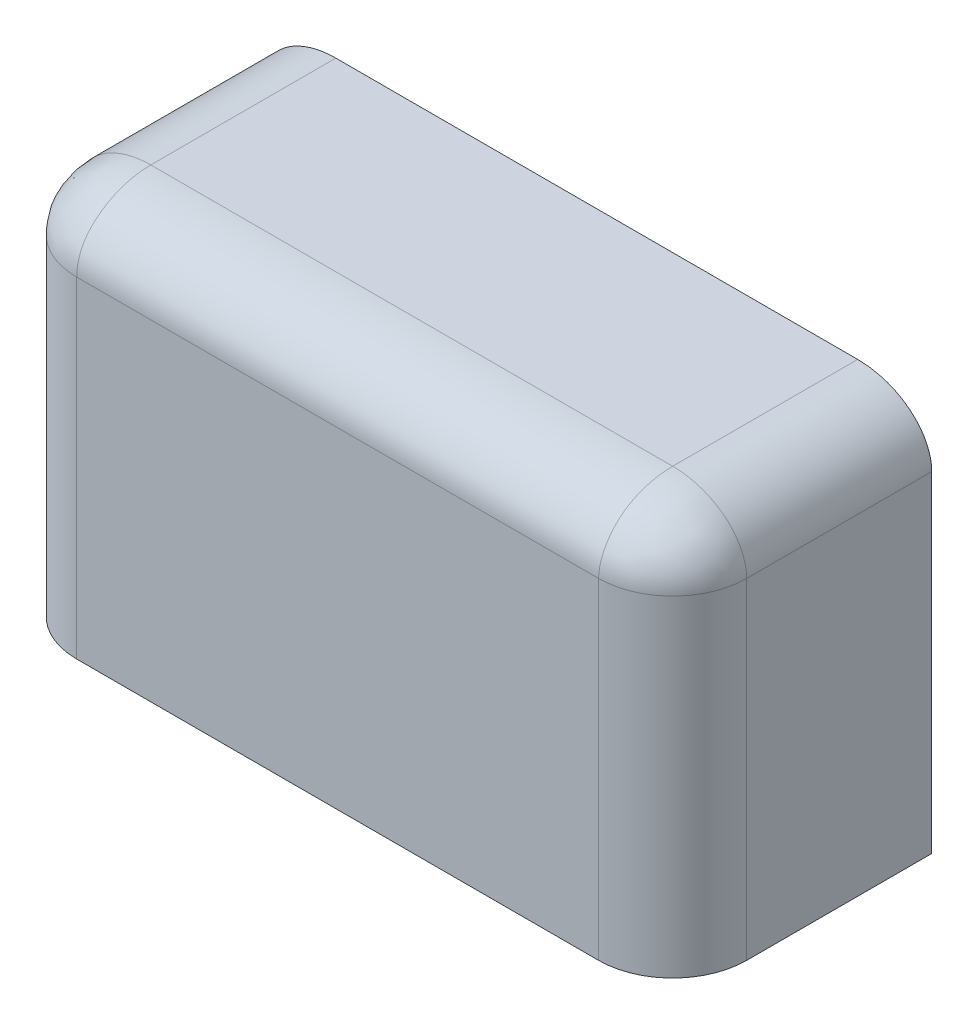
ISO-10303-21;
HEADER;
FILE_DESCRIPTION(('STEP AP214'),'2;1');
FILE_NAME('part.step','',(''),(''),'','','');
FILE_SCHEMA(('AUTOMOTIVE_DESIGN { 1 0 10303 214 1 1 1 1 }'));
ENDSEC;
DATA;
#1=APPLICATION_CONTEXT('core data for automotive mechanical design processes');
#2=APPLICATION_PROTOCOL_DEFINITION('international standard','automotive_design',2000,#1);
#3=PRODUCT_CONTEXT('',#1,'mechanical');
#4=PRODUCT('Part','Part','',(#3));
#5=PRODUCT_RELATED_PRODUCT_CATEGORY('part','',(#4));
#6=PRODUCT_DEFINITION_FORMATION('','',#4);
#7=PRODUCT_DEFINITION_CONTEXT('part definition',#1,'design');
#8=PRODUCT_DEFINITION('design','',#6,#7);
#9=PRODUCT_DEFINITION_SHAPE('','',#8);
#10=(LENGTH_UNIT() NAMED_UNIT(*) SI_UNIT(.MILLI.,.METRE.));
#11=(NAMED_UNIT(*) PLANE_ANGLE_UNIT() SI_UNIT($,.RADIAN.));
#12=(NAMED_UNIT(*) SI_UNIT($,.STERADIAN.) SOLID_ANGLE_UNIT());
#13=UNCERTAINTY_MEASURE_WITH_UNIT(LENGTH_MEASURE(1.E-05),#10,'distance_accuracy_value','');
#14=(GEOMETRIC_REPRESENTATION_CONTEXT(3) GLOBAL_UNCERTAINTY_ASSIGNED_CONTEXT((#13)) GLOBAL_UNIT_ASSIGNED_CONTEXT((#10,
#11,#12)) REPRESENTATION_CONTEXT('',''));
#15=CARTESIAN_POINT('',(0.,0.,0.));
#16=DIRECTION('',(0.,0.,1.));
#17=DIRECTION('',(1.,0.,0.));
#18=AXIS2_PLACEMENT_3D('',#15,#16,#17);
#19=CARTESIAN_POINT('',(6.89300000000001,1.646875,9.145));
#20=CARTESIAN_POINT('',(1.00700000000001,1.646875,9.145));
#21=CARTESIAN_POINT('',(6.89300000000001,1.728125,9.145));
#22=CARTESIAN_POINT('',(1.00700000000001,1.728125,9.145));
#23=CARTESIAN_POINT('',(6.89300000000001,1.728125,9.04500000000001));
#24=CARTESIAN_POINT('',(1.00700000000001,1.728125,9.04500000000001));
#25=(BOUNDED_SURFACE() B_SPLINE_SURFACE(2,1,((#19,#20),(#21,#22),(#23,#24)),.UNSPECIFIED.,.F.,
.F.,.F.) B_SPLINE_SURFACE_WITH_KNOTS((3,3),(2,2),(0.,0.157079632679477),(0.,0.5886),
.UNSPECIFIED.) GEOMETRIC_REPRESENTATION_ITEM() RATIONAL_B_SPLINE_SURFACE(((1.,1.),
(0.707106781186592,0.707106781186592),(1.,1.))) REPRESENTATION_ITEM('') SURFACE());
#26=CARTESIAN_POINT('',(4.08800000000001,1.646875,9.145));
#27=CARTESIAN_POINT('',(4.08800000008538,1.64784121551079,9.14500002913551));
#28=CARTESIAN_POINT('',(4.08799712587005,1.64880741868321,9.14497878841751));
#29=CARTESIAN_POINT('',(4.08798669487844,1.65072184907224,9.14489468705347));
#30=CARTESIAN_POINT('',(4.08797921695327,1.65167010746846,9.14483252606202));
#31=CARTESIAN_POINT('',(4.08796073751127,1.65354691512894,9.14466888422808));
#32=CARTESIAN_POINT('',(4.08794979815781,1.65447552506544,9.14456809089738));
#33=CARTESIAN_POINT('',(4.08792545115165,1.65631150980605,9.14432962203084));
#34=CARTESIAN_POINT('',(4.0879120898129,1.65721897274695,9.14419261952062));
#35=CARTESIAN_POINT('',(4.08788384784134,1.65901133064115,9.14388422642394));
#36=CARTESIAN_POINT('',(4.08786899858087,1.65989633931593,9.14371349323268));
#37=CARTESIAN_POINT('',(4.08783862251913,1.66164264696131,9.14334017914098));
#38=CARTESIAN_POINT('',(4.08782311310937,1.66250408329896,9.14313823884373));
#39=CARTESIAN_POINT('',(4.08779215168235,1.66420228856385,9.14270507051369));
#40=CARTESIAN_POINT('',(4.08777670408079,1.66503921658062,9.1424744653773));
#41=CARTESIAN_POINT('',(4.08774649607258,1.66668762401255,9.14198652692844));
#42=CARTESIAN_POINT('',(4.08773172815048,1.66749928232381,9.14172979801903));
#43=CARTESIAN_POINT('',(4.08770340695862,1.6690965369633,9.14119215181674));
#44=CARTESIAN_POINT('',(4.08768983532491,1.66988233009174,9.14091181977343));
#45=CARTESIAN_POINT('',(4.08766433549995,1.67142739900859,9.14032947052088));
#46=CARTESIAN_POINT('',(4.08765237921761,1.67218688761969,9.14002801884776));
#47=CARTESIAN_POINT('',(4.08763044477962,1.67367904087995,9.13940588133218));
#48=CARTESIAN_POINT('',(4.08762042996387,1.67441193249281,9.13908574086143));
#49=CARTESIAN_POINT('',(4.0876026237761,1.67585072004349,9.138428613691));
#50=CARTESIAN_POINT('',(4.08759478837945,1.67655685529574,9.13809215179342));
#51=CARTESIAN_POINT('',(4.08758150374989,1.67794209407518,9.13740468766164));
#52=CARTESIAN_POINT('',(4.08757600434403,1.67862144724752,9.13705418952258));
#53=CARTESIAN_POINT('',(4.0875674732723,1.67995316857554,9.13634089604688));
#54=CARTESIAN_POINT('',(4.08756438664039,1.6806057956812,9.135978583403));
#55=CARTESIAN_POINT('',(4.08755893087129,1.68249971039437,9.13489003797296));
#56=CARTESIAN_POINT('',(4.08755987665968,1.68372611801359,9.13413767158116));
#57=CARTESIAN_POINT('',(4.0875713429439,1.68607306381442,9.13260644035507));
#58=CARTESIAN_POINT('',(4.0875813683653,1.68719580265248,9.13183092994232));
#59=CARTESIAN_POINT('',(4.0876094732935,1.68933919287416,9.13026770050558));
#60=CARTESIAN_POINT('',(4.08762707850913,1.69036206045577,9.1294830094203));
#61=CARTESIAN_POINT('',(4.08766815585539,1.69231023205196,9.12791406254203));
#62=CARTESIAN_POINT('',(4.08769122018975,1.6932377306513,9.12713251680655));
#63=CARTESIAN_POINT('',(4.08774047223442,1.69500033391819,9.12558079604631));
#64=CARTESIAN_POINT('',(4.08776636992656,1.69583757118276,9.12481303126196));
#65=CARTESIAN_POINT('',(4.08781831590242,1.69742518202679,9.12329820183076));
#66=CARTESIAN_POINT('',(4.08784423472043,1.6981775948014,9.12255326774538));
#67=CARTESIAN_POINT('',(4.08789255287597,1.69960125031349,9.12109193543051));
#68=CARTESIAN_POINT('',(4.08791507105923,1.70027441379872,9.12037740997164));
#69=CARTESIAN_POINT('',(4.08795430861005,1.7015452597165,9.11898336686188));
#70=CARTESIAN_POINT('',(4.08797134389381,1.7021447262055,9.11830548625516));
#71=CARTESIAN_POINT('',(4.08799221265772,1.70327369907627,9.116990022562));
#72=CARTESIAN_POINT('',(4.08799703766568,1.7038048439651,9.1163538574323));
#73=CARTESIAN_POINT('',(4.08800633830618,1.70544555930297,9.11433451089498));
#74=CARTESIAN_POINT('',(4.08800414924348,1.70652449153292,9.11292623255284));
#75=CARTESIAN_POINT('',(4.08801078923052,1.70857725386046,9.11008801090438));
#76=CARTESIAN_POINT('',(4.08801934729364,1.70955302256446,9.10865946336097));
#77=CARTESIAN_POINT('',(4.08804476046452,1.71140406565511,9.10579197270239));
#78=CARTESIAN_POINT('',(4.08806139051596,1.71228131329827,9.10435430015859));
#79=CARTESIAN_POINT('',(4.08809049431457,1.71394865510063,9.10146424601309));
#80=CARTESIAN_POINT('',(4.08810303852678,1.71474004998219,9.10001261455416));
#81=CARTESIAN_POINT('',(4.08811864639176,1.71624488906093,9.09709110864104));
#82=CARTESIAN_POINT('',(4.08812182008632,1.71695914235206,9.09562165110982));
#83=CARTESIAN_POINT('',(4.08812322689579,1.71831245516666,9.09266934008545));
#84=CARTESIAN_POINT('',(4.08812151741246,1.71895229706085,9.09118684478782));
#85=CARTESIAN_POINT('',(4.08811459186155,1.72015956718829,9.08821260842374));
#86=CARTESIAN_POINT('',(4.08810941650262,1.72072774611069,9.08672117166391));
#87=CARTESIAN_POINT('',(4.08809735124867,1.72179441844926,9.08373259521167));
#88=CARTESIAN_POINT('',(4.08809048138198,1.72229362655125,9.08223571025864));
#89=CARTESIAN_POINT('',(4.08807628121304,1.72322499401868,9.07923922101693));
#90=CARTESIAN_POINT('',(4.08806895677997,1.72365782805085,9.0777398262));
#91=CARTESIAN_POINT('',(4.08805481880035,1.72445895462084,9.07474079509188));
#92=CARTESIAN_POINT('',(4.08804800069062,1.7248278781179,9.07324132721347));
#93=CARTESIAN_POINT('',(4.08803551906345,1.72550353106243,9.07024416884574));
#94=CARTESIAN_POINT('',(4.08802984470494,1.72581084431755,9.06874660989172));
#95=CARTESIAN_POINT('',(4.08802000275877,1.72636543805768,9.06575487313305));
#96=CARTESIAN_POINT('',(4.08801582160568,1.72661325194436,9.06426079416448));
#97=CARTESIAN_POINT('',(4.08800904503433,1.72705079930041,9.06127724739038));
#98=CARTESIAN_POINT('',(4.08800643632424,1.72724101264432,9.05978784992688));
#99=CARTESIAN_POINT('',(4.08800262840614,1.72756508057354,9.05681456213647));
#100=CARTESIAN_POINT('',(4.08800141848312,1.72769935848808,9.05533071792146));
#101=CARTESIAN_POINT('',(4.08800001843425,1.72791303071054,9.05236913982555));
#102=CARTESIAN_POINT('',(4.08799982149008,1.72799278882665,9.05089143216654));
#103=CARTESIAN_POINT('',(4.08799979458485,1.72809861944531,9.04794247431517));
#104=CARTESIAN_POINT('',(4.08799996255202,1.72812499339234,9.04647123493985));
#105=CARTESIAN_POINT('',(4.08800000000001,1.728125,9.04500000000001));
#106=B_SPLINE_CURVE_WITH_KNOTS('',3,(#26,#27,#28,#29,#30,#31,#32,#33,#34,#35,#36,#37,#38,#39,
#40,#41,#42,#43,#44,#45,#46,#47,#48,#49,#50,#51,#52,#53,#54,#55,#56,#57,#58,#59,#60,#61,#62,#63,
#64,#65,#66,#67,#68,#69,#70,#71,#72,#73,#74,#75,#76,#77,#78,#79,#80,#81,#82,#83,#84,#85,#86,#87,
#88,#89,#90,#91,#92,#93,#94,#95,#96,#97,#98,#99,#100,#101,#102,#103,#104,#105),.UNSPECIFIED.,
.F.,.F.,(4,2,2,2,2,2,2,2,2,2,2,2,2,2,2,2,2,2,2,2,2,2,2,2,2,2,2,2,2,2,2,2,2,2,2,2,2,2,2,4),(0.,
0.00289838836293901,0.00574846416443204,0.00855001234060927,0.0113027609305556,
0.0140063788483132,0.0166604770394338,0.0192646124759638,0.0218182944210215,0.0243209923999056,
0.0267721453436243,0.0291711714169603,0.0315174781011406,0.0338104721659721,0.0360495692333714,
0.0403633966732016,0.0444552990403839,0.0483217046226117,0.0519598148752808,0.0553676976251021,
0.0585443324045858,0.0614896227636302,0.0642043935059561,0.0666903940006155,0.0720095209169233,
0.0771971801957827,0.0822478557878143,0.0872061411657844,0.092105963130045,0.0969484255234785,
0.101734985381406,0.10646747476428,0.111148114766487,0.115779524177721,0.120364724289243,
0.124907140497022,0.129410600686818,0.133879329903729,0.138317940507968,0.14273141688772),.UNSPECIFIED.);
#107=CARTESIAN_POINT('',(4.08800000000001,1.646875,9.145));
#108=VERTEX_POINT('',#107);
#109=CARTESIAN_POINT('',(4.08800000000001,1.728125,9.04500000000001));
#110=VERTEX_POINT('',#109);
#111=EDGE_CURVE('E115',#108,#110,#106,.T.);
#112=DIRECTION('',(1.,0.,0.));
#113=VECTOR('',#112,1.);
#114=CARTESIAN_POINT('',(3.29630000000001,1.646875,9.145));
#115=LINE('',#114,#113);
#116=CARTESIAN_POINT('',(4.79300000000001,1.646875,9.145));
#117=VERTEX_POINT('',#116);
#118=EDGE_CURVE('E114',#117,#108,#115,.F.);
#119=CARTESIAN_POINT('',(4.79300000000001,1.728125,9.04500000000001));
#120=CARTESIAN_POINT('',(4.79300003738922,1.72812499339662,9.04647097569353));
#121=CARTESIAN_POINT('',(4.79300021751912,1.72809862874169,9.04794195581107));
#122=CARTESIAN_POINT('',(4.7930002351904,1.72799283427721,9.05089042654896));
#123=CARTESIAN_POINT('',(4.79300007076745,1.72791310197927,9.05236790631677));
#124=CARTESIAN_POINT('',(4.79299875192521,1.7276994956822,9.05532906349068));
#125=CARTESIAN_POINT('',(4.79299759077266,1.72756525672898,9.05681271459689));
#126=CARTESIAN_POINT('',(4.79299389200109,1.72724127740611,9.05978565376598));
#127=CARTESIAN_POINT('',(4.7929913437208,1.72705111246993,9.06127489558991));
#128=CARTESIAN_POINT('',(4.79298469477534,1.72661366874137,9.06425817059622));
#129=CARTESIAN_POINT('',(4.79298058083393,1.72636590875858,9.06575213325467));
#130=CARTESIAN_POINT('',(4.79297087502154,1.72581142557779,9.06874367793545));
#131=CARTESIAN_POINT('',(4.79296526955914,1.7255041675985,9.07024116088013));
#132=CARTESIAN_POINT('',(4.79295292226885,1.72482862378996,9.07323820787544));
#133=CARTESIAN_POINT('',(4.79294616953181,1.72445975272644,9.07473764008608));
#134=CARTESIAN_POINT('',(4.7929321536794,1.72365872542083,9.07773663966515));
#135=CARTESIAN_POINT('',(4.79292488589266,1.72322593676444,9.07923603825131));
#136=CARTESIAN_POINT('',(4.79291078531682,1.72229465032673,9.08223257306471));
#137=CARTESIAN_POINT('',(4.79290395825255,1.72179547641519,9.08372949938637));
#138=CARTESIAN_POINT('',(4.79289196012591,1.72072885877384,9.08671819393433));
#139=CARTESIAN_POINT('',(4.79288680891629,1.72016069890764,9.08820970692603));
#140=CARTESIAN_POINT('',(4.79287990838921,1.71895344947917,9.09118412760387));
#141=CARTESIAN_POINT('',(4.79287819957919,1.71831360781225,9.09266673043275));
#142=CARTESIAN_POINT('',(4.79287958133355,1.71696027465356,9.09561928406713));
#143=CARTESIAN_POINT('',(4.79288272907884,1.71624599943344,9.09708887607995));
#144=CARTESIAN_POINT('',(4.79289825133128,1.71474109260331,9.10001067364684));
#145=CARTESIAN_POINT('',(4.7929107356354,1.71394965062109,9.10146246164782));
#146=CARTESIAN_POINT('',(4.79293969618667,1.71228219283246,9.10435283855332));
#147=CARTESIAN_POINT('',(4.79295624251376,1.7114048754344,9.10579067685465));
#148=CARTESIAN_POINT('',(4.79298145030758,1.70955366101192,9.10865851776488));
#149=CARTESIAN_POINT('',(4.79298988560929,1.70857778912976,9.11008724880474));
#150=CARTESIAN_POINT('',(4.79299621382604,1.70652478440017,9.11292585030185));
#151=CARTESIAN_POINT('',(4.79299383398717,1.70544571130949,9.11433432381203));
#152=CARTESIAN_POINT('',(4.79300288010121,1.70380508275985,9.11635356352924));
#153=CARTESIAN_POINT('',(4.79300762470075,1.7032741843835,9.11698944130571));
#154=CARTESIAN_POINT('',(4.7930283591839,1.70214569027477,9.11830438025559));
#155=CARTESIAN_POINT('',(4.7930453447371,1.70154645568708,9.11898202324253));
#156=CARTESIAN_POINT('',(4.79308449828277,1.70027605734686,9.12037564204188));
#157=CARTESIAN_POINT('',(4.79310698405652,1.69960310901419,9.12108998035621));
#158=CARTESIAN_POINT('',(4.79315525465327,1.69817986460073,9.12255099008573));
#159=CARTESIAN_POINT('',(4.79318115986047,1.69742764702119,9.12329578808097));
#160=CARTESIAN_POINT('',(4.7932330927627,1.69584040369671,9.12481039703646));
#161=CARTESIAN_POINT('',(4.79325899185962,1.69500333777574,9.12557807655958));
#162=CARTESIAN_POINT('',(4.79330825860162,1.69324104994514,9.1271296776075));
#163=CARTESIAN_POINT('',(4.79333133668362,1.69231369423055,9.12791118775766));
#164=CARTESIAN_POINT('',(4.79337245033568,1.69036577620043,9.12948011218397));
#165=CARTESIAN_POINT('',(4.79339007820943,1.68934301788303,9.13026481496887));
#166=CARTESIAN_POINT('',(4.79341823405428,1.68719980861542,9.13182811297166));
#167=CARTESIAN_POINT('',(4.79342828757408,1.68607713987284,9.13260367847523));
#168=CARTESIAN_POINT('',(4.79343981231775,1.68373029114581,9.13413505978097));
#169=CARTESIAN_POINT('',(4.79344078812047,1.68250390877234,9.13488751900867));
#170=CARTESIAN_POINT('',(4.79343537618633,1.68061001180406,9.13597621680294));
#171=CARTESIAN_POINT('',(4.79343230413431,1.67995737875786,9.13633858765706));
#172=CARTESIAN_POINT('',(4.79342380157753,1.67862563254858,9.13705200429067));
#173=CARTESIAN_POINT('',(4.79341831604617,1.67794626020794,9.13740256702958));
#174=CARTESIAN_POINT('',(4.79340505818092,1.67656096949762,9.13809016583869));
#175=CARTESIAN_POINT('',(4.79339723561184,1.67585480125638,9.13842669743825));
#176=CARTESIAN_POINT('',(4.79337945380474,1.67441593359981,9.13908396809976));
#177=CARTESIAN_POINT('',(4.79336945048047,1.67368299464679,9.13940418195659));
#178=CARTESIAN_POINT('',(4.79334753751507,1.67219073212079,9.14002646880908));
#179=CARTESIAN_POINT('',(4.79333559115487,1.67143118136673,9.14032799600232));
#180=CARTESIAN_POINT('',(4.7933101094935,1.66988597321253,9.140910497212));
#181=CARTESIAN_POINT('',(4.793296546047,1.66910010278091,9.14119090523409));
#182=CARTESIAN_POINT('',(4.79326823945359,1.66750267832547,9.14172870254531));
#183=CARTESIAN_POINT('',(4.79325347789522,1.66669092730408,9.1419855060995));
#184=CARTESIAN_POINT('',(4.79322328082821,1.66504231910832,9.14247359111747));
#185=CARTESIAN_POINT('',(4.79320783776526,1.66420528285482,9.1427042676663));
#186=CARTESIAN_POINT('',(4.79317688371295,1.66250684577929,9.14313757413736));
#187=CARTESIAN_POINT('',(4.79316137711095,1.66164528570197,9.1433395806256));
#188=CARTESIAN_POINT('',(4.79313100514839,1.65989871540263,9.14371302037875));
#189=CARTESIAN_POINT('',(4.79311615716333,1.65901356766803,9.14388381247827));
#190=CARTESIAN_POINT('',(4.79308791652196,1.65722091681294,9.14419231458217));
#191=CARTESIAN_POINT('',(4.79307455523601,1.65631329984867,9.14432936660584));
#192=CARTESIAN_POINT('',(4.79305020752594,1.65447699273827,9.14456792357697));
#193=CARTESIAN_POINT('',(4.79303926742947,1.65354821435927,9.14466875489172));
#194=CARTESIAN_POINT('',(4.79302078622149,1.65167105620345,9.14483245965246));
#195=CARTESIAN_POINT('',(4.79301330730424,1.65072261568745,9.14489464495973));
#196=CARTESIAN_POINT('',(4.79300287470131,1.64880780837332,9.14497877986172));
#197=CARTESIAN_POINT('',(4.7929999999163,1.64784141036084,9.14500002915846));
#198=CARTESIAN_POINT('',(4.79300000000001,1.646875,9.145));
#199=B_SPLINE_CURVE_WITH_KNOTS('',3,(#119,#120,#121,#122,#123,#124,#125,#126,#127,#128,#129,
#130,#131,#132,#133,#134,#135,#136,#137,#138,#139,#140,#141,#142,#143,#144,#145,#146,#147,#148,
#149,#150,#151,#152,#153,#154,#155,#156,#157,#158,#159,#160,#161,#162,#163,#164,#165,#166,#167,
#168,#169,#170,#171,#172,#173,#174,#175,#176,#177,#178,#179,#180,#181,#182,#183,#184,#185,#186,
#187,#188,#189,#190,#191,#192,#193,#194,#195,#196,#197,#198),.UNSPECIFIED.,.F.,.F.,(4,2,2,2,2,2,
2,2,2,2,2,2,2,2,2,2,2,2,2,2,2,2,2,2,2,2,2,2,2,2,2,2,2,2,2,2,2,2,2,4),(0.,0.00441269875037949,
0.00885062294364818,0.0133187649501418,0.0178217436225782,0.0223637888718419,0.0269487317220377,
0.0315799989180711,0.0362606112886055,0.0409931853667153,0.0457799382517662,0.0506226963622402,
0.0555229095692246,0.0604816731841384,0.0655328791177371,0.0707211645454439,0.0760410125914168,
0.0785258761751849,0.0812396494963361,0.084184087112369,0.087360018204277,0.09076735000571,
0.094405065021158,0.0982712332468428,0.102363057390457,0.106676965977473,0.108916163187339,
0.111209296865378,0.113555782375464,0.115955026174802,0.118406435384922,0.120909427772954,
0.123463441844917,0.126067946685468,0.128722451113668,0.131426511666216,0.134179738873194,
0.136981801262346,0.139832426522018,0.142731399275595),.UNSPECIFIED.);
#200=CARTESIAN_POINT('',(4.79300000000001,1.728125,9.04500000000001));
#201=VERTEX_POINT('',#200);
#202=EDGE_CURVE('E93',#201,#117,#199,.T.);
#203=DIRECTION('',(1.,0.,0.));
#204=VECTOR('',#203,1.);
#205=CARTESIAN_POINT('',(5.58470000000001,1.728125,9.04500000000001));
#206=LINE('',#205,#204);
#207=EDGE_CURVE('E82',#110,#201,#206,.T.);
#208=ORIENTED_EDGE('',*,*,#111,.F.);
#209=ORIENTED_EDGE('',*,*,#118,.F.);
#210=ORIENTED_EDGE('',*,*,#202,.F.);
#211=ORIENTED_EDGE('',*,*,#207,.F.);
#212=EDGE_LOOP('',(#208,#209,#210,#211));
#213=FACE_BOUND('',#212,.T.);
#214=ADVANCED_FACE('F17',(#213),#25,.T.);
#215=CARTESIAN_POINT('',(4.74221463413441,1.6868618902342,9.1157019547178));
#216=CARTESIAN_POINT('',(4.76315314257711,1.7038744283439,9.116167129687));
#217=CARTESIAN_POINT('',(4.77807657128851,1.7159997141719,9.0953911529267));
#218=CARTESIAN_POINT('',(4.79300000000001,1.728125,9.0746151761663));
#219=CARTESIAN_POINT('',(4.79300000000001,1.728125,9.04500000000001));
#220=CARTESIAN_POINT('',(4.79142926826881,1.6455987804684,9.18640390943551));
#221=CARTESIAN_POINT('',(4.83330628515421,1.6796238566878,9.1873342593741));
#222=CARTESIAN_POINT('',(4.86315314257711,1.7038744283439,9.1457823058533));
#223=CARTESIAN_POINT('',(4.89300000000001,1.728125,9.1042303523325));
#224=CARTESIAN_POINT('',(4.89300000000001,1.728125,9.04500000000001));
#225=CARTESIAN_POINT('',(4.84221463413441,1.6056118902342,9.1157019547178));
#226=CARTESIAN_POINT('',(4.86315314257711,1.6226244283439,9.116167129687));
#227=CARTESIAN_POINT('',(4.87807657128851,1.6347497141719,9.0953911529267));
#228=CARTESIAN_POINT('',(4.89300000000001,1.646875,9.0746151761663));
#229=CARTESIAN_POINT('',(4.89300000000001,1.646875,9.04500000000001));
#230=(BOUNDED_SURFACE() B_SPLINE_SURFACE(2,2,((#215,#216,#217,#218,#219),(#220,#221,#222,#223,
#224),(#225,#226,#227,#228,#229)),.UNSPECIFIED.,.F.,.F.,.F.) B_SPLINE_SURFACE_WITH_KNOTS((3,3),
(3,2,3),(0.0785398163397407,0.235619449019226),(2.28480849704972,3.1198107549776,
3.95481301290548),.UNSPECIFIED.) GEOMETRIC_REPRESENTATION_ITEM() RATIONAL_B_SPLINE_SURFACE(((1.,
0.922369618366414,1.,0.922369618366414,1.),(0.707106781186553,0.652213811907345,
0.707106781186553,0.652213811907345,0.707106781186553),(1.,0.922369618366414,1.,
0.922369618366414,1.))) REPRESENTATION_ITEM('') SURFACE());
#231=CARTESIAN_POINT('',(4.79300000000002,1.646875,9.04500000000001));
#232=DIRECTION('',(0.,-1.,0.));
#233=DIRECTION('',(0.,0.,-1.));
#234=AXIS2_PLACEMENT_3D('',#231,#232,#233);
#235=CIRCLE('',#234,0.099999999999989);
#236=CARTESIAN_POINT('',(4.89300000000001,1.646875,9.04500000000001));
#237=VERTEX_POINT('',#236);
#238=EDGE_CURVE('E97',#237,#117,#235,.T.);
#239=CARTESIAN_POINT('',(4.89300000000001,1.646875,9.04500000000001));
#240=CARTESIAN_POINT('',(4.89300000000001,1.728125,9.04500000000001));
#241=CARTESIAN_POINT('',(4.79300000000001,1.728125,9.04500000000001));
#242=(BOUNDED_CURVE() B_SPLINE_CURVE(2,(#239,#240,#241),.UNSPECIFIED.,.F.,
.F.) B_SPLINE_CURVE_WITH_KNOTS((3,3),(0.,0.157079632679491),
.UNSPECIFIED.) CURVE() GEOMETRIC_REPRESENTATION_ITEM() RATIONAL_B_SPLINE_CURVE((1.,
0.707106781186543,1.)) REPRESENTATION_ITEM(''));
#243=EDGE_CURVE('E99',#201,#237,#242,.F.);
#244=ORIENTED_EDGE('',*,*,#202,.T.);
#245=ORIENTED_EDGE('',*,*,#238,.F.);
#246=ORIENTED_EDGE('',*,*,#243,.F.);
#247=EDGE_LOOP('',(#244,#245,#246));
#248=FACE_BOUND('',#247,.T.);
#249=ADVANCED_FACE('F96',(#248),#230,.T.);
#250=CARTESIAN_POINT('',(4.79300000000002,1.4640625,9.04500000000001));
#251=DIRECTION('',(0.,-1.,0.));
#252=DIRECTION('',(0.,0.,-1.));
#253=AXIS2_PLACEMENT_3D('',#250,#251,#252);
#254=CYLINDRICAL_SURFACE('',#253,0.099999999999989);
#255=DIRECTION('',(0.,1.,0.));
#256=VECTOR('',#255,1.);
#257=CARTESIAN_POINT('',(4.79300000000001,2.2694125,9.145));
#258=LINE('',#257,#256);
#259=CARTESIAN_POINT('',(4.79300000000001,1.2,9.145));
#260=VERTEX_POINT('',#259);
#261=EDGE_CURVE('E110',#260,#117,#258,.T.);
#262=ORIENTED_EDGE('',*,*,#261,.F.);
#263=CARTESIAN_POINT('',(4.79300000000002,1.2,9.04500000000001));
#264=DIRECTION('',(0.,-1.,0.));
#265=DIRECTION('',(0.,0.,-1.));
#266=AXIS2_PLACEMENT_3D('',#263,#264,#265);
#267=CIRCLE('',#266,0.099999999999989);
#268=CARTESIAN_POINT('',(4.89300000000001,1.2,9.04500000000001));
#269=VERTEX_POINT('',#268);
#270=EDGE_CURVE('E317',#269,#260,#267,.T.);
#271=ORIENTED_EDGE('',*,*,#270,.F.);
#272=DIRECTION('',(0.,1.,0.));
#273=VECTOR('',#272,1.);
#274=CARTESIAN_POINT('',(4.89300000000001,2.2694125,9.04500000000001));
#275=LINE('',#274,#273);
#276=EDGE_CURVE('E112',#237,#269,#275,.F.);
#277=ORIENTED_EDGE('',*,*,#276,.F.);
#278=ORIENTED_EDGE('',*,*,#238,.T.);
#279=EDGE_LOOP('',(#262,#271,#277,#278));
#280=FACE_BOUND('',#279,.T.);
#281=ADVANCED_FACE('F107',(#280),#254,.T.);
#282=CARTESIAN_POINT('',(3.29630000000001,2.2694125,9.145));
#283=DIRECTION('',(0.,0.,1.));
#284=DIRECTION('',(1.,0.,0.));
#285=AXIS2_PLACEMENT_3D('',#282,#283,#284);
#286=PLANE('',#285);
#287=ORIENTED_EDGE('',*,*,#261,.T.);
#288=ORIENTED_EDGE('',*,*,#118,.T.);
#289=DIRECTION('',(0.,1.,0.));
#290=VECTOR('',#289,1.);
#291=CARTESIAN_POINT('',(4.088,1.4640625,9.145));
#292=LINE('',#291,#290);
#293=CARTESIAN_POINT('',(4.088,1.2,9.145));
#294=VERTEX_POINT('',#293);
#295=EDGE_CURVE('E118',#294,#108,#292,.T.);
#296=ORIENTED_EDGE('',*,*,#295,.F.);
#297=DIRECTION('',(1.,0.,0.));
#298=VECTOR('',#297,1.);
#299=CARTESIAN_POINT('',(5.58470000000001,1.2,9.145));
#300=LINE('',#299,#298);
#301=EDGE_CURVE('E122',#260,#294,#300,.F.);
#302=ORIENTED_EDGE('',*,*,#301,.F.);
#303=EDGE_LOOP('',(#287,#288,#296,#302));
#304=FACE_BOUND('',#303,.T.);
#305=ADVANCED_FACE('F120',(#304),#286,.T.);
#306=CARTESIAN_POINT('',(4.088,1.4640625,9.04500000000001));
#307=DIRECTION('',(0.,1.,0.));
#308=DIRECTION('',(0.,0.,1.));
#309=AXIS2_PLACEMENT_3D('',#306,#307,#308);
#310=CYLINDRICAL_SURFACE('',#309,0.099999999999989);
#311=ORIENTED_EDGE('',*,*,#295,.T.);
#312=CARTESIAN_POINT('',(4.088,1.646875,9.04500000000001));
#313=DIRECTION('',(0.,1.,0.));
#314=DIRECTION('',(0.,0.,1.));
#315=AXIS2_PLACEMENT_3D('',#312,#313,#314);
#316=CIRCLE('',#315,0.099999999999989);
#317=CARTESIAN_POINT('',(3.98800000000001,1.646875,9.04500000000001));
#318=VERTEX_POINT('',#317);
#319=EDGE_CURVE('E74',#318,#108,#316,.T.);
#320=ORIENTED_EDGE('',*,*,#319,.F.);
#321=DIRECTION('',(0.,1.,0.));
#322=VECTOR('',#321,1.);
#323=CARTESIAN_POINT('',(3.98800000000001,0.658712499999998,9.04500000000001));
#324=LINE('',#323,#322);
#325=CARTESIAN_POINT('',(3.98800000000001,1.2,9.04500000000001));
#326=VERTEX_POINT('',#325);
#327=EDGE_CURVE('E150',#326,#318,#324,.T.);
#328=ORIENTED_EDGE('',*,*,#327,.F.);
#329=CARTESIAN_POINT('',(4.088,1.2,9.04500000000001));
#330=DIRECTION('',(0.,1.,0.));
#331=DIRECTION('',(0.,0.,1.));
#332=AXIS2_PLACEMENT_3D('',#329,#330,#331);
#333=CIRCLE('',#332,0.099999999999989);
#334=EDGE_CURVE('E311',#294,#326,#333,.F.);
#335=ORIENTED_EDGE('',*,*,#334,.F.);
#336=EDGE_LOOP('',(#311,#320,#328,#335));
#337=FACE_BOUND('',#336,.T.);
#338=ADVANCED_FACE('F185',(#337),#310,.T.);
#339=CARTESIAN_POINT('',(4.03878536586561,1.6056118902342,9.1157019547178));
#340=CARTESIAN_POINT('',(4.01784685742291,1.6226244283439,9.1161671296871));
#341=CARTESIAN_POINT('',(4.00292342871151,1.6347497141719,9.0953911529267));
#342=CARTESIAN_POINT('',(3.98800000000001,1.646875,9.0746151761663));
#343=CARTESIAN_POINT('',(3.98800000000001,1.646875,9.04500000000001));
#344=CARTESIAN_POINT('',(4.08957073173121,1.6455987804684,9.18640390943551));
#345=CARTESIAN_POINT('',(4.04769371484581,1.6796238566878,9.1873342593741));
#346=CARTESIAN_POINT('',(4.01784685742291,1.7038744283439,9.1457823058533));
#347=CARTESIAN_POINT('',(3.98800000000001,1.728125,9.1042303523326));
#348=CARTESIAN_POINT('',(3.98800000000001,1.728125,9.04500000000001));
#349=CARTESIAN_POINT('',(4.13878536586561,1.6868618902342,9.1157019547178));
#350=CARTESIAN_POINT('',(4.11784685742291,1.7038744283439,9.1161671296871));
#351=CARTESIAN_POINT('',(4.10292342871141,1.7159997141719,9.0953911529267));
#352=CARTESIAN_POINT('',(4.08800000000001,1.728125,9.0746151761663));
#353=CARTESIAN_POINT('',(4.08800000000001,1.728125,9.04500000000001));
#354=(BOUNDED_SURFACE() B_SPLINE_SURFACE(2,2,((#339,#340,#341,#342,#343),(#344,#345,#346,#347,
#348),(#349,#350,#351,#352,#353)),.UNSPECIFIED.,.F.,.F.,.F.) B_SPLINE_SURFACE_WITH_KNOTS((3,3),
(3,2,3),(0.0785398163397521,0.235619449019233),(2.28480849704973,3.11981075497758,
3.95481301290543),.UNSPECIFIED.) GEOMETRIC_REPRESENTATION_ITEM() RATIONAL_B_SPLINE_SURFACE(((1.,
0.922369618366421,1.,0.922369618366421,1.),(0.707106781186578,0.652213811907372,
0.707106781186578,0.652213811907372,0.707106781186578),(1.,0.922369618366421,1.,
0.922369618366421,1.))) REPRESENTATION_ITEM('') SURFACE());
#355=CARTESIAN_POINT('',(3.98800000000001,1.646875,9.04500000000001));
#356=CARTESIAN_POINT('',(3.98800000000001,1.728125,9.04500000000001));
#357=CARTESIAN_POINT('',(4.08800000000001,1.728125,9.04500000000001));
#358=(BOUNDED_CURVE() B_SPLINE_CURVE(2,(#355,#356,#357),.UNSPECIFIED.,.F.,
.F.) B_SPLINE_CURVE_WITH_KNOTS((3,3),(0.,0.157079632679491),
.UNSPECIFIED.) CURVE() GEOMETRIC_REPRESENTATION_ITEM() RATIONAL_B_SPLINE_CURVE((1.,
0.707106781186543,1.)) REPRESENTATION_ITEM(''));
#359=EDGE_CURVE('E152',#318,#110,#358,.T.);
#360=ORIENTED_EDGE('',*,*,#111,.T.);
#361=ORIENTED_EDGE('',*,*,#359,.F.);
#362=ORIENTED_EDGE('',*,*,#319,.T.);
#363=EDGE_LOOP('',(#360,#361,#362));
#364=FACE_BOUND('',#363,.T.);
#365=ADVANCED_FACE('F172',(#364),#354,.T.);
#366=CARTESIAN_POINT('',(5.58470000000001,1.728125,9.7812));
#367=DIRECTION('',(0.,1.,0.));
#368=DIRECTION('',(0.,0.,1.));
#369=AXIS2_PLACEMENT_3D('',#366,#367,#368);
#370=PLANE('',#369);
#371=DIRECTION('',(0.,0.,-1.));
#372=VECTOR('',#371,1.);
#373=CARTESIAN_POINT('',(4.08800000000001,1.728125,8.535));
#374=LINE('',#373,#372);
#375=CARTESIAN_POINT('',(4.08800000000001,1.728125,8.795));
#376=VERTEX_POINT('',#375);
#377=EDGE_CURVE('E156',#110,#376,#374,.T.);
#378=ORIENTED_EDGE('',*,*,#377,.F.);
#379=ORIENTED_EDGE('',*,*,#207,.T.);
#380=DIRECTION('',(0.,0.,1.));
#381=VECTOR('',#380,1.);
#382=CARTESIAN_POINT('',(4.79300000000001,1.728125,9.405));
#383=LINE('',#382,#381);
#384=CARTESIAN_POINT('',(4.79300000000001,1.728125,8.795));
#385=VERTEX_POINT('',#384);
#386=EDGE_CURVE('E134',#385,#201,#383,.T.);
#387=ORIENTED_EDGE('',*,*,#386,.F.);
#388=DIRECTION('',(-1.,0.,0.));
#389=VECTOR('',#388,1.);
#390=CARTESIAN_POINT('',(5.58470000000001,1.728125,8.795));
#391=LINE('',#390,#389);
#392=EDGE_CURVE('E303',#376,#385,#391,.F.);
#393=ORIENTED_EDGE('',*,*,#392,.F.);
#394=EDGE_LOOP('',(#378,#379,#387,#393));
#395=FACE_BOUND('',#394,.T.);
#396=ADVANCED_FACE('F184',(#395),#370,.T.);
#397=CARTESIAN_POINT('',(4.89300000000001,1.646875,6.795));
#398=CARTESIAN_POINT('',(4.89300000000001,1.646875,12.015));
#399=CARTESIAN_POINT('',(4.89300000000001,1.728125,6.795));
#400=CARTESIAN_POINT('',(4.89300000000001,1.728125,12.015));
#401=CARTESIAN_POINT('',(4.79300000000001,1.728125,6.795));
#402=CARTESIAN_POINT('',(4.79300000000001,1.728125,12.015));
#403=(BOUNDED_SURFACE() B_SPLINE_SURFACE(2,1,((#397,#398),(#399,#400),(#401,#402)),
.UNSPECIFIED.,.F.,.F.,.F.) B_SPLINE_SURFACE_WITH_KNOTS((3,3),(2,2),(0.,0.157079632679491),(0.,
0.522),.UNSPECIFIED.) GEOMETRIC_REPRESENTATION_ITEM() RATIONAL_B_SPLINE_SURFACE(((1.,1.),
(0.707106781186543,0.707106781186543),(1.,1.))) REPRESENTATION_ITEM('') SURFACE());
#404=DIRECTION('',(0.,0.,-1.));
#405=VECTOR('',#404,1.);
#406=CARTESIAN_POINT('',(4.89300000000001,1.646875,9.7812));
#407=LINE('',#406,#405);
#408=CARTESIAN_POINT('',(4.89300000000001,1.646875,8.795));
#409=VERTEX_POINT('',#408);
#410=EDGE_CURVE('E133',#409,#237,#407,.F.);
#411=CARTESIAN_POINT('',(4.79300000000001,1.728125,8.795));
#412=CARTESIAN_POINT('',(4.80402320692542,1.72813655458881,8.795));
#413=CARTESIAN_POINT('',(4.81523314138615,1.72662927197719,8.795));
#414=CARTESIAN_POINT('',(4.83916427894289,1.71983719553953,8.795));
#415=CARTESIAN_POINT('',(4.85167177844062,1.71379101769117,8.795));
#416=CARTESIAN_POINT('',(4.86973741169922,1.69961556087333,8.795));
#417=CARTESIAN_POINT('',(4.8762428430771,1.69274675825383,8.795));
#418=CARTESIAN_POINT('',(4.88390633779755,1.68102500837394,8.795));
#419=CARTESIAN_POINT('',(4.88611856541315,1.67685191604047,8.795));
#420=CARTESIAN_POINT('',(4.88967197936387,1.66815357759772,8.795));
#421=CARTESIAN_POINT('',(4.89101528828676,1.66362922010062,8.795));
#422=CARTESIAN_POINT('',(4.89262473181272,1.65501564014404,8.795));
#423=CARTESIAN_POINT('',(4.89300998146417,1.65094816436953,8.795));
#424=CARTESIAN_POINT('',(4.89300000000001,1.64687500000194,8.795));
#425=B_SPLINE_CURVE_WITH_KNOTS('',3,(#411,#412,#413,#414,#415,#416,#417,#418,#419,#420,#421,
#422,#423,#424),.UNSPECIFIED.,.F.,.F.,(4,2,2,2,2,2,4),(0.,0.0333204515951678,0.0740065568756553,
0.101846403930917,0.115936563001147,0.12999217144294,0.142185939532156),.UNSPECIFIED.);
#426=EDGE_CURVE('E238',#385,#409,#425,.T.);
#427=ORIENTED_EDGE('',*,*,#243,.T.);
#428=ORIENTED_EDGE('',*,*,#410,.F.);
#429=ORIENTED_EDGE('',*,*,#426,.F.);
#430=ORIENTED_EDGE('',*,*,#386,.T.);
#431=EDGE_LOOP('',(#427,#428,#429,#430));
#432=FACE_BOUND('',#431,.T.);
#433=ADVANCED_FACE('F267',(#432),#403,.T.);
#434=CARTESIAN_POINT('',(4.89300000000001,2.2694125,9.7812));
#435=DIRECTION('',(1.,0.,0.));
#436=DIRECTION('',(0.,0.,-1.));
#437=AXIS2_PLACEMENT_3D('',#434,#435,#436);
#438=PLANE('',#437);
#439=DIRECTION('',(0.,0.,-1.));
#440=VECTOR('',#439,1.);
#441=CARTESIAN_POINT('',(4.89300000000001,1.2,9.7812));
#442=LINE('',#441,#440);
#443=CARTESIAN_POINT('',(4.89300000000001,1.2,8.795));
#444=VERTEX_POINT('',#443);
#445=EDGE_CURVE('E132',#444,#269,#442,.F.);
#446=ORIENTED_EDGE('',*,*,#445,.F.);
#447=DIRECTION('',(0.,1.,0.));
#448=VECTOR('',#447,1.);
#449=CARTESIAN_POINT('',(4.89300000000001,0.658712499999998,8.795));
#450=LINE('',#449,#448);
#451=EDGE_CURVE('E295',#409,#444,#450,.F.);
#452=ORIENTED_EDGE('',*,*,#451,.F.);
#453=ORIENTED_EDGE('',*,*,#410,.T.);
#454=ORIENTED_EDGE('',*,*,#276,.T.);
#455=EDGE_LOOP('',(#446,#452,#453,#454));
#456=FACE_BOUND('',#455,.T.);
#457=ADVANCED_FACE('F264',(#456),#438,.T.);
#458=CARTESIAN_POINT('',(5.58470000000001,1.2,9.7812));
#459=DIRECTION('',(0.,-1.,0.));
#460=DIRECTION('',(0.,0.,-1.));
#461=AXIS2_PLACEMENT_3D('',#458,#459,#460);
#462=PLANE('',#461);
#463=ORIENTED_EDGE('',*,*,#301,.T.);
#464=ORIENTED_EDGE('',*,*,#334,.T.);
#465=DIRECTION('',(0.,0.,1.));
#466=VECTOR('',#465,1.);
#467=CARTESIAN_POINT('',(3.98800000000001,1.2,9.7812));
#468=LINE('',#467,#466);
#469=CARTESIAN_POINT('',(3.98800000000001,1.2,8.795));
#470=VERTEX_POINT('',#469);
#471=EDGE_CURVE('E153',#470,#326,#468,.T.);
#472=ORIENTED_EDGE('',*,*,#471,.F.);
#473=DIRECTION('',(-1.,0.,0.));
#474=VECTOR('',#473,1.);
#475=CARTESIAN_POINT('',(5.58470000000001,1.2,8.795));
#476=LINE('',#475,#474);
#477=EDGE_CURVE('E292',#444,#470,#476,.T.);
#478=ORIENTED_EDGE('',*,*,#477,.F.);
#479=ORIENTED_EDGE('',*,*,#445,.T.);
#480=ORIENTED_EDGE('',*,*,#270,.T.);
#481=EDGE_LOOP('',(#463,#464,#472,#478,#479,#480));
#482=FACE_BOUND('',#481,.T.);
#483=ADVANCED_FACE('F261',(#482),#462,.T.);
#484=CARTESIAN_POINT('',(3.98800000000001,0.658712499999998,9.7812));
#485=DIRECTION('',(-1.,0.,0.));
#486=DIRECTION('',(0.,0.,1.));
#487=AXIS2_PLACEMENT_3D('',#484,#485,#486);
#488=PLANE('',#487);
#489=ORIENTED_EDGE('',*,*,#471,.T.);
#490=ORIENTED_EDGE('',*,*,#327,.T.);
#491=DIRECTION('',(0.,0.,1.));
#492=VECTOR('',#491,1.);
#493=CARTESIAN_POINT('',(3.98800000000001,1.646875,8.535));
#494=LINE('',#493,#492);
#495=CARTESIAN_POINT('',(3.98800000000001,1.646875,8.795));
#496=VERTEX_POINT('',#495);
#497=EDGE_CURVE('E38',#496,#318,#494,.T.);
#498=ORIENTED_EDGE('',*,*,#497,.F.);
#499=DIRECTION('',(0.,1.,0.));
#500=VECTOR('',#499,1.);
#501=CARTESIAN_POINT('',(3.98800000000001,0.658712499999998,8.795));
#502=LINE('',#501,#500);
#503=EDGE_CURVE('E29',#470,#496,#502,.T.);
#504=ORIENTED_EDGE('',*,*,#503,.F.);
#505=EDGE_LOOP('',(#489,#490,#498,#504));
#506=FACE_BOUND('',#505,.T.);
#507=ADVANCED_FACE('F252',(#506),#488,.T.);
#508=CARTESIAN_POINT('',(3.98800000000001,1.646875,11.145));
#509=CARTESIAN_POINT('',(3.98800000000001,1.646875,5.925));
#510=CARTESIAN_POINT('',(3.98800000000001,1.728125,11.145));
#511=CARTESIAN_POINT('',(3.98800000000001,1.728125,5.925));
#512=CARTESIAN_POINT('',(4.08800000000001,1.728125,11.145));
#513=CARTESIAN_POINT('',(4.08800000000001,1.728125,5.925));
#514=(BOUNDED_SURFACE() B_SPLINE_SURFACE(2,1,((#508,#509),(#510,#511),(#512,#513)),
.UNSPECIFIED.,.F.,.F.,.F.) B_SPLINE_SURFACE_WITH_KNOTS((3,3),(2,2),(0.,0.157079632679491),(0.,
0.522),.UNSPECIFIED.) GEOMETRIC_REPRESENTATION_ITEM() RATIONAL_B_SPLINE_SURFACE(((1.,1.),
(0.707106781186543,0.707106781186543),(1.,1.))) REPRESENTATION_ITEM('') SURFACE());
#515=CARTESIAN_POINT('',(3.98800000000001,1.646875,8.795));
#516=CARTESIAN_POINT('',(3.98799612220586,1.65076192933696,8.795));
#517=CARTESIAN_POINT('',(3.98834374009822,1.65463978900022,8.795));
#518=CARTESIAN_POINT('',(3.98969591444816,1.66225867337324,8.795));
#519=CARTESIAN_POINT('',(3.99069697077167,1.66600031562401,8.795));
#520=CARTESIAN_POINT('',(3.99460805760166,1.67687996790922,8.795));
#521=CARTESIAN_POINT('',(3.99842664357768,1.68370290673362,8.795));
#522=CARTESIAN_POINT('',(4.00820987712698,1.69648104483452,8.795));
#523=CARTESIAN_POINT('',(4.01433065413611,1.70231141573687,8.795));
#524=CARTESIAN_POINT('',(4.02902834836803,1.71306686713505,8.795));
#525=CARTESIAN_POINT('',(4.037848073717,1.71765078139235,8.795));
#526=CARTESIAN_POINT('',(4.05811536312055,1.72502793720727,8.79500000000001));
#527=CARTESIAN_POINT('',(4.06974504731522,1.72732155576809,8.79500000000002));
#528=CARTESIAN_POINT('',(4.0836033699622,1.7280662442184,8.79500000000001));
#529=CARTESIAN_POINT('',(4.08580314529187,1.7281251115514,8.795));
#530=CARTESIAN_POINT('',(4.08800000000001,1.728125,8.795));
#531=B_SPLINE_CURVE_WITH_KNOTS('',3,(#515,#516,#517,#518,#519,#520,#521,#522,#523,#524,#525,
#526,#527,#528,#529,#530),.UNSPECIFIED.,.F.,.F.,(4,2,2,2,2,2,2,4),(0.,0.0116293394616217,
0.0231968921208538,0.0462459242016979,0.0712742396060012,0.100717968847394,0.135705181929724,
0.142302895184157),.UNSPECIFIED.);
#532=EDGE_CURVE('E11',#496,#376,#531,.T.);
#533=ORIENTED_EDGE('',*,*,#532,.F.);
#534=ORIENTED_EDGE('',*,*,#497,.T.);
#535=ORIENTED_EDGE('',*,*,#359,.T.);
#536=ORIENTED_EDGE('',*,*,#377,.T.);
#537=EDGE_LOOP('',(#533,#534,#535,#536));
#538=FACE_BOUND('',#537,.T.);
#539=ADVANCED_FACE('F246',(#538),#514,.T.);
#540=CARTESIAN_POINT('',(5.58470000000001,0.658712499999998,8.795));
#541=DIRECTION('',(0.,0.,-1.));
#542=DIRECTION('',(-1.,0.,0.));
#543=AXIS2_PLACEMENT_3D('',#540,#541,#542);
#544=PLANE('',#543);
#545=ORIENTED_EDGE('',*,*,#503,.T.);
#546=ORIENTED_EDGE('',*,*,#532,.T.);
#547=ORIENTED_EDGE('',*,*,#392,.T.);
#548=ORIENTED_EDGE('',*,*,#426,.T.);
#549=ORIENTED_EDGE('',*,*,#451,.T.);
#550=ORIENTED_EDGE('',*,*,#477,.T.);
#551=EDGE_LOOP('',(#545,#546,#547,#548,#549,#550));
#552=FACE_BOUND('',#551,.T.);
#553=ADVANCED_FACE('F244',(#552),#544,.T.);
#554=CLOSED_SHELL('',(#214,#249,#281,#305,#338,#365,#396,#433,#457,#483,#507,#539,#553));
#555=MANIFOLD_SOLID_BREP('B1',#554);
#556=ADVANCED_BREP_SHAPE_REPRESENTATION('',(#18,#555),#14);
#557=SHAPE_DEFINITION_REPRESENTATION(#9,#556);
ENDSEC;
END-ISO-10303-21;
